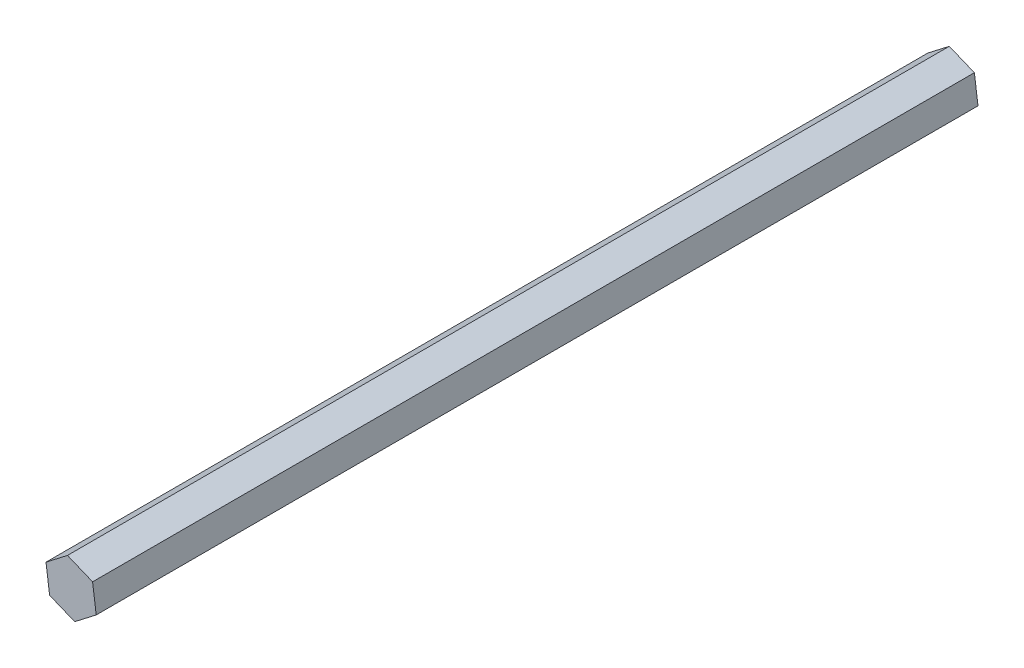
ISO-10303-21;
HEADER;
FILE_DESCRIPTION(('STEP AP214'),'2;1');
FILE_NAME('part.step','',(''),(''),'','','');
FILE_SCHEMA(('AUTOMOTIVE_DESIGN { 1 0 10303 214 1 1 1 1 }'));
ENDSEC;
DATA;
#1=APPLICATION_CONTEXT('core data for automotive mechanical design processes');
#2=APPLICATION_PROTOCOL_DEFINITION('international standard','automotive_design',2000,#1);
#3=PRODUCT_CONTEXT('',#1,'mechanical');
#4=PRODUCT('Part','Part','',(#3));
#5=PRODUCT_RELATED_PRODUCT_CATEGORY('part','',(#4));
#6=PRODUCT_DEFINITION_FORMATION('','',#4);
#7=PRODUCT_DEFINITION_CONTEXT('part definition',#1,'design');
#8=PRODUCT_DEFINITION('design','',#6,#7);
#9=PRODUCT_DEFINITION_SHAPE('','',#8);
#10=(LENGTH_UNIT() NAMED_UNIT(*) SI_UNIT(.MILLI.,.METRE.));
#11=(NAMED_UNIT(*) PLANE_ANGLE_UNIT() SI_UNIT($,.RADIAN.));
#12=(NAMED_UNIT(*) SI_UNIT($,.STERADIAN.) SOLID_ANGLE_UNIT());
#13=UNCERTAINTY_MEASURE_WITH_UNIT(LENGTH_MEASURE(1.E-05),#10,'distance_accuracy_value','');
#14=(GEOMETRIC_REPRESENTATION_CONTEXT(3) GLOBAL_UNCERTAINTY_ASSIGNED_CONTEXT((#13)) GLOBAL_UNIT_ASSIGNED_CONTEXT((#10,
#11,#12)) REPRESENTATION_CONTEXT('',''));
#15=CARTESIAN_POINT('',(0.,0.,0.));
#16=DIRECTION('',(0.,0.,1.));
#17=DIRECTION('',(1.,0.,0.));
#18=AXIS2_PLACEMENT_3D('',#15,#16,#17);
#19=CARTESIAN_POINT('',(6.78228934684399,-2.78637480411733,254.));
#20=DIRECTION('',(-0.991063416149329,-0.133391548347044,0.));
#21=DIRECTION('',(0.133391548347044,-0.991063416149329,0.));
#22=AXIS2_PLACEMENT_3D('',#19,#20,#21);
#23=PLANE('',#22);
#24=DIRECTION('',(0.,0.,-1.));
#25=VECTOR('',#24,1.);
#26=CARTESIAN_POINT('',(6.78228934684399,-2.78637480411733,254.));
#27=LINE('',#26,#25);
#28=CARTESIAN_POINT('',(6.78228934684399,-2.78637480411733,254.));
#29=VERTEX_POINT('',#28);
#30=CARTESIAN_POINT('',(6.78228934684399,-2.78637480411733,15.748));
#31=VERTEX_POINT('',#30);
#32=EDGE_CURVE('E114',#29,#31,#27,.T.);
#33=ORIENTED_EDGE('',*,*,#32,.T.);
#34=DIRECTION('',(-0.133391548347044,0.991063416149329,0.));
#35=VECTOR('',#34,1.);
#36=CARTESIAN_POINT('',(6.78228934684399,-2.78637480411733,15.748));
#37=LINE('',#36,#35);
#38=CARTESIAN_POINT('',(5.80421603825249,4.48044746812479,15.748));
#39=VERTEX_POINT('',#38);
#40=EDGE_CURVE('E47',#31,#39,#37,.T.);
#41=ORIENTED_EDGE('',*,*,#40,.T.);
#42=DIRECTION('',(0.,0.,-1.));
#43=VECTOR('',#42,1.);
#44=CARTESIAN_POINT('',(5.80421603825249,4.48044746812479,254.));
#45=LINE('',#44,#43);
#46=CARTESIAN_POINT('',(5.80421603825249,4.48044746812479,254.));
#47=VERTEX_POINT('',#46);
#48=EDGE_CURVE('E40',#47,#39,#45,.T.);
#49=ORIENTED_EDGE('',*,*,#48,.F.);
#50=DIRECTION('',(-0.133391548347044,0.991063416149329,0.));
#51=VECTOR('',#50,1.);
#52=CARTESIAN_POINT('',(6.78228934684399,-2.78637480411733,254.));
#53=LINE('',#52,#51);
#54=EDGE_CURVE('E125',#29,#47,#53,.T.);
#55=ORIENTED_EDGE('',*,*,#54,.F.);
#56=EDGE_LOOP('',(#33,#41,#49,#55));
#57=FACE_BOUND('',#56,.T.);
#58=ADVANCED_FACE('F33',(#57),#23,.F.);
#59=CARTESIAN_POINT('',(5.80421603825249,4.48044746812479,254.));
#60=DIRECTION('',(-0.380011238555985,-0.92498186932023,0.));
#61=DIRECTION('',(0.92498186932023,-0.380011238555985,0.));
#62=AXIS2_PLACEMENT_3D('',#59,#60,#61);
#63=PLANE('',#62);
#64=ORIENTED_EDGE('',*,*,#48,.T.);
#65=DIRECTION('',(-0.92498186932023,0.380011238555985,0.));
#66=VECTOR('',#65,1.);
#67=CARTESIAN_POINT('',(5.80421603825249,4.48044746812479,15.748));
#68=LINE('',#67,#66);
#69=CARTESIAN_POINT('',(-0.978073308591482,7.26682227224213,15.748));
#70=VERTEX_POINT('',#69);
#71=EDGE_CURVE('E86',#39,#70,#68,.T.);
#72=ORIENTED_EDGE('',*,*,#71,.T.);
#73=DIRECTION('',(0.,0.,-1.));
#74=VECTOR('',#73,1.);
#75=CARTESIAN_POINT('',(-0.978073308591489,7.26682227224213,254.));
#76=LINE('',#75,#74);
#77=CARTESIAN_POINT('',(-0.978073308591489,7.26682227224213,254.));
#78=VERTEX_POINT('',#77);
#79=EDGE_CURVE('E98',#78,#70,#76,.T.);
#80=ORIENTED_EDGE('',*,*,#79,.F.);
#81=DIRECTION('',(-0.92498186932023,0.380011238555985,0.));
#82=VECTOR('',#81,1.);
#83=CARTESIAN_POINT('',(5.80421603825249,4.48044746812479,254.));
#84=LINE('',#83,#82);
#85=EDGE_CURVE('E123',#47,#78,#84,.T.);
#86=ORIENTED_EDGE('',*,*,#85,.F.);
#87=EDGE_LOOP('',(#64,#72,#80,#86));
#88=FACE_BOUND('',#87,.T.);
#89=ADVANCED_FACE('F97',(#88),#63,.F.);
#90=CARTESIAN_POINT('',(-0.978073308591489,7.26682227224213,254.));
#91=DIRECTION('',(0.611052177593345,-0.791590320973186,0.));
#92=DIRECTION('',(0.791590320973186,0.611052177593345,0.));
#93=AXIS2_PLACEMENT_3D('',#90,#91,#92);
#94=PLANE('',#93);
#95=ORIENTED_EDGE('',*,*,#79,.T.);
#96=DIRECTION('',(-0.791590320973186,-0.611052177593345,0.));
#97=VECTOR('',#96,1.);
#98=CARTESIAN_POINT('',(-0.978073308591489,7.26682227224213,15.748));
#99=LINE('',#98,#97);
#100=CARTESIAN_POINT('',(-6.78228934684398,2.78637480411733,15.748));
#101=VERTEX_POINT('',#100);
#102=EDGE_CURVE('E83',#70,#101,#99,.T.);
#103=ORIENTED_EDGE('',*,*,#102,.T.);
#104=DIRECTION('',(0.,0.,-1.));
#105=VECTOR('',#104,1.);
#106=CARTESIAN_POINT('',(-6.78228934684398,2.78637480411733,254.));
#107=LINE('',#106,#105);
#108=CARTESIAN_POINT('',(-6.78228934684398,2.78637480411733,254.));
#109=VERTEX_POINT('',#108);
#110=EDGE_CURVE('E104',#109,#101,#107,.T.);
#111=ORIENTED_EDGE('',*,*,#110,.F.);
#112=DIRECTION('',(-0.791590320973186,-0.611052177593345,0.));
#113=VECTOR('',#112,1.);
#114=CARTESIAN_POINT('',(-0.978073308591489,7.26682227224213,254.));
#115=LINE('',#114,#113);
#116=EDGE_CURVE('E103',#78,#109,#115,.T.);
#117=ORIENTED_EDGE('',*,*,#116,.F.);
#118=EDGE_LOOP('',(#95,#103,#111,#117));
#119=FACE_BOUND('',#118,.T.);
#120=ADVANCED_FACE('F102',(#119),#94,.F.);
#121=CARTESIAN_POINT('',(-6.78228934684398,2.78637480411733,254.));
#122=DIRECTION('',(0.991063416149329,0.133391548347044,0.));
#123=DIRECTION('',(-0.133391548347044,0.991063416149329,0.));
#124=AXIS2_PLACEMENT_3D('',#121,#122,#123);
#125=PLANE('',#124);
#126=ORIENTED_EDGE('',*,*,#110,.T.);
#127=DIRECTION('',(0.133391548347044,-0.991063416149329,0.));
#128=VECTOR('',#127,1.);
#129=CARTESIAN_POINT('',(-6.78228934684398,2.78637480411733,15.748));
#130=LINE('',#129,#128);
#131=CARTESIAN_POINT('',(-5.80421603825249,-4.48044746812479,15.748));
#132=VERTEX_POINT('',#131);
#133=EDGE_CURVE('E88',#101,#132,#130,.T.);
#134=ORIENTED_EDGE('',*,*,#133,.T.);
#135=DIRECTION('',(0.,0.,-1.));
#136=VECTOR('',#135,1.);
#137=CARTESIAN_POINT('',(-5.80421603825249,-4.48044746812479,254.));
#138=LINE('',#137,#136);
#139=CARTESIAN_POINT('',(-5.80421603825249,-4.48044746812479,254.));
#140=VERTEX_POINT('',#139);
#141=EDGE_CURVE('E106',#140,#132,#138,.T.);
#142=ORIENTED_EDGE('',*,*,#141,.F.);
#143=DIRECTION('',(0.133391548347044,-0.991063416149329,0.));
#144=VECTOR('',#143,1.);
#145=CARTESIAN_POINT('',(-6.78228934684398,2.78637480411733,254.));
#146=LINE('',#145,#144);
#147=EDGE_CURVE('E120',#109,#140,#146,.T.);
#148=ORIENTED_EDGE('',*,*,#147,.F.);
#149=EDGE_LOOP('',(#126,#134,#142,#148));
#150=FACE_BOUND('',#149,.T.);
#151=ADVANCED_FACE('F143',(#150),#125,.F.);
#152=CARTESIAN_POINT('',(-5.80421603825249,-4.48044746812479,254.));
#153=DIRECTION('',(0.380011238555985,0.92498186932023,0.));
#154=DIRECTION('',(-0.92498186932023,0.380011238555985,0.));
#155=AXIS2_PLACEMENT_3D('',#152,#153,#154);
#156=PLANE('',#155);
#157=ORIENTED_EDGE('',*,*,#141,.T.);
#158=DIRECTION('',(0.92498186932023,-0.380011238555985,0.));
#159=VECTOR('',#158,1.);
#160=CARTESIAN_POINT('',(-5.80421603825249,-4.48044746812479,15.748));
#161=LINE('',#160,#159);
#162=CARTESIAN_POINT('',(0.97807330859149,-7.26682227224213,15.748));
#163=VERTEX_POINT('',#162);
#164=EDGE_CURVE('E129',#132,#163,#161,.T.);
#165=ORIENTED_EDGE('',*,*,#164,.T.);
#166=DIRECTION('',(0.,0.,-1.));
#167=VECTOR('',#166,1.);
#168=CARTESIAN_POINT('',(0.97807330859149,-7.26682227224213,254.));
#169=LINE('',#168,#167);
#170=CARTESIAN_POINT('',(0.97807330859149,-7.26682227224213,254.));
#171=VERTEX_POINT('',#170);
#172=EDGE_CURVE('E111',#171,#163,#169,.T.);
#173=ORIENTED_EDGE('',*,*,#172,.F.);
#174=DIRECTION('',(0.92498186932023,-0.380011238555985,0.));
#175=VECTOR('',#174,1.);
#176=CARTESIAN_POINT('',(-5.80421603825249,-4.48044746812479,254.));
#177=LINE('',#176,#175);
#178=EDGE_CURVE('E118',#140,#171,#177,.T.);
#179=ORIENTED_EDGE('',*,*,#178,.F.);
#180=EDGE_LOOP('',(#157,#165,#173,#179));
#181=FACE_BOUND('',#180,.T.);
#182=ADVANCED_FACE('F133',(#181),#156,.F.);
#183=CARTESIAN_POINT('',(0.97807330859149,-7.26682227224213,254.));
#184=DIRECTION('',(-0.611052177593345,0.791590320973186,0.));
#185=DIRECTION('',(-0.791590320973186,-0.611052177593345,0.));
#186=AXIS2_PLACEMENT_3D('',#183,#184,#185);
#187=PLANE('',#186);
#188=ORIENTED_EDGE('',*,*,#172,.T.);
#189=DIRECTION('',(0.791590320973186,0.611052177593345,0.));
#190=VECTOR('',#189,1.);
#191=CARTESIAN_POINT('',(0.97807330859149,-7.26682227224213,15.748));
#192=LINE('',#191,#190);
#193=EDGE_CURVE('E11',#163,#31,#192,.T.);
#194=ORIENTED_EDGE('',*,*,#193,.T.);
#195=ORIENTED_EDGE('',*,*,#32,.F.);
#196=DIRECTION('',(0.791590320973186,0.611052177593345,0.));
#197=VECTOR('',#196,1.);
#198=CARTESIAN_POINT('',(0.97807330859149,-7.26682227224213,254.));
#199=LINE('',#198,#197);
#200=EDGE_CURVE('E54',#171,#29,#199,.T.);
#201=ORIENTED_EDGE('',*,*,#200,.F.);
#202=EDGE_LOOP('',(#188,#194,#195,#201));
#203=FACE_BOUND('',#202,.T.);
#204=ADVANCED_FACE('F137',(#203),#187,.F.);
#205=CARTESIAN_POINT('',(0.,0.,254.));
#206=DIRECTION('',(0.,0.,1.));
#207=DIRECTION('',(1.,0.,0.));
#208=AXIS2_PLACEMENT_3D('',#205,#206,#207);
#209=PLANE('',#208);
#210=ORIENTED_EDGE('',*,*,#54,.T.);
#211=ORIENTED_EDGE('',*,*,#85,.T.);
#212=ORIENTED_EDGE('',*,*,#116,.T.);
#213=ORIENTED_EDGE('',*,*,#147,.T.);
#214=ORIENTED_EDGE('',*,*,#178,.T.);
#215=ORIENTED_EDGE('',*,*,#200,.T.);
#216=EDGE_LOOP('',(#210,#211,#212,#213,#214,#215));
#217=FACE_BOUND('',#216,.T.);
#218=ADVANCED_FACE('F140',(#217),#209,.T.);
#219=CARTESIAN_POINT('',(0.,0.,15.748));
#220=DIRECTION('',(0.,0.,1.));
#221=DIRECTION('',(1.,0.,0.));
#222=AXIS2_PLACEMENT_3D('',#219,#220,#221);
#223=PLANE('',#222);
#224=ORIENTED_EDGE('',*,*,#193,.F.);
#225=ORIENTED_EDGE('',*,*,#164,.F.);
#226=ORIENTED_EDGE('',*,*,#133,.F.);
#227=ORIENTED_EDGE('',*,*,#102,.F.);
#228=ORIENTED_EDGE('',*,*,#71,.F.);
#229=ORIENTED_EDGE('',*,*,#40,.F.);
#230=EDGE_LOOP('',(#224,#225,#226,#227,#228,#229));
#231=FACE_BOUND('',#230,.T.);
#232=ADVANCED_FACE('F85',(#231),#223,.F.);
#233=CLOSED_SHELL('',(#58,#89,#120,#151,#182,#204,#218,#232));
#234=MANIFOLD_SOLID_BREP('B2',#233);
#235=ADVANCED_BREP_SHAPE_REPRESENTATION('',(#18,#234),#14);
#236=SHAPE_DEFINITION_REPRESENTATION(#9,#235);
ENDSEC;
END-ISO-10303-21;
